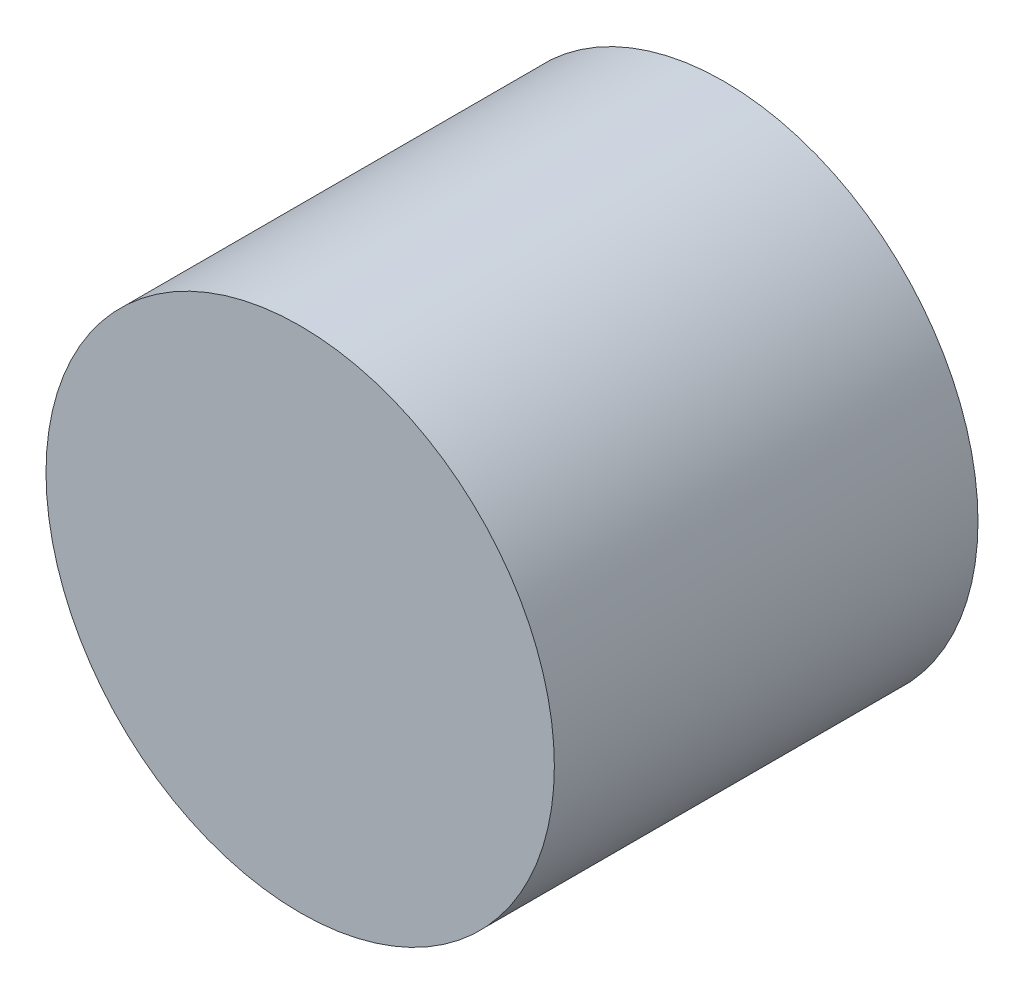
ISO-10303-21;
HEADER;
FILE_DESCRIPTION(('STEP AP214'),'2;1');
FILE_NAME('part.step','',(''),(''),'','','');
FILE_SCHEMA(('AUTOMOTIVE_DESIGN { 1 0 10303 214 1 1 1 1 }'));
ENDSEC;
DATA;
#1=APPLICATION_CONTEXT('core data for automotive mechanical design processes');
#2=APPLICATION_PROTOCOL_DEFINITION('international standard','automotive_design',2000,#1);
#3=PRODUCT_CONTEXT('',#1,'mechanical');
#4=PRODUCT('Part','Part','',(#3));
#5=PRODUCT_RELATED_PRODUCT_CATEGORY('part','',(#4));
#6=PRODUCT_DEFINITION_FORMATION('','',#4);
#7=PRODUCT_DEFINITION_CONTEXT('part definition',#1,'design');
#8=PRODUCT_DEFINITION('design','',#6,#7);
#9=PRODUCT_DEFINITION_SHAPE('','',#8);
#10=(LENGTH_UNIT() NAMED_UNIT(*) SI_UNIT(.MILLI.,.METRE.));
#11=(NAMED_UNIT(*) PLANE_ANGLE_UNIT() SI_UNIT($,.RADIAN.));
#12=(NAMED_UNIT(*) SI_UNIT($,.STERADIAN.) SOLID_ANGLE_UNIT());
#13=UNCERTAINTY_MEASURE_WITH_UNIT(LENGTH_MEASURE(1.E-05),#10,'distance_accuracy_value','');
#14=(GEOMETRIC_REPRESENTATION_CONTEXT(3) GLOBAL_UNCERTAINTY_ASSIGNED_CONTEXT((#13)) GLOBAL_UNIT_ASSIGNED_CONTEXT((#10,
#11,#12)) REPRESENTATION_CONTEXT('',''));
#15=CARTESIAN_POINT('',(0.,0.,0.));
#16=DIRECTION('',(0.,0.,1.));
#17=DIRECTION('',(1.,0.,0.));
#18=AXIS2_PLACEMENT_3D('',#15,#16,#17);
#19=CARTESIAN_POINT('',(0.,0.,5.));
#20=DIRECTION('',(0.,0.,-1.));
#21=DIRECTION('',(-1.,0.,0.));
#22=AXIS2_PLACEMENT_3D('',#19,#20,#21);
#23=CYLINDRICAL_SURFACE('',#22,1.5);
#24=CARTESIAN_POINT('',(0.,0.,0.));
#25=DIRECTION('',(0.,0.,1.));
#26=DIRECTION('',(1.,0.,0.));
#27=AXIS2_PLACEMENT_3D('',#24,#25,#26);
#28=CIRCLE('',#27,1.5);
#29=CARTESIAN_POINT('',(-1.11803398874989,1.,0.));
#30=VERTEX_POINT('',#29);
#31=CARTESIAN_POINT('',(1.11803398874989,1.,0.));
#32=VERTEX_POINT('',#31);
#33=EDGE_CURVE('E74',#30,#32,#28,.T.);
#34=ORIENTED_EDGE('',*,*,#33,.T.);
#35=DIRECTION('',(0.,0.,-1.));
#36=VECTOR('',#35,1.);
#37=CARTESIAN_POINT('',(1.11803398874989,1.,5.));
#38=LINE('',#37,#36);
#39=CARTESIAN_POINT('',(1.11803398874989,1.,5.));
#40=VERTEX_POINT('',#39);
#41=EDGE_CURVE('E11',#40,#32,#38,.T.);
#42=ORIENTED_EDGE('',*,*,#41,.F.);
#43=CARTESIAN_POINT('',(0.,0.,5.));
#44=DIRECTION('',(0.,0.,1.));
#45=DIRECTION('',(1.,0.,0.));
#46=AXIS2_PLACEMENT_3D('',#43,#44,#45);
#47=CIRCLE('',#46,1.5);
#48=CARTESIAN_POINT('',(-1.1180339887499,1.,5.));
#49=VERTEX_POINT('',#48);
#50=EDGE_CURVE('E67',#40,#49,#47,.T.);
#51=ORIENTED_EDGE('',*,*,#50,.T.);
#52=DIRECTION('',(0.,0.,-1.));
#53=VECTOR('',#52,1.);
#54=CARTESIAN_POINT('',(-1.11803398874989,1.,5.));
#55=LINE('',#54,#53);
#56=EDGE_CURVE('E43',#49,#30,#55,.T.);
#57=ORIENTED_EDGE('',*,*,#56,.T.);
#58=EDGE_LOOP('',(#34,#42,#51,#57));
#59=FACE_BOUND('',#58,.T.);
#60=CARTESIAN_POINT('',(0.,0.,7.));
#61=DIRECTION('',(0.,0.,1.));
#62=DIRECTION('',(1.,0.,0.));
#63=AXIS2_PLACEMENT_3D('',#60,#61,#62);
#64=CIRCLE('',#63,1.5);
#65=CARTESIAN_POINT('',(1.5,0.,7.));
#66=VERTEX_POINT('',#65);
#67=EDGE_CURVE('E70',#66,#66,#64,.T.);
#68=ORIENTED_EDGE('',*,*,#67,.F.);
#69=EDGE_LOOP('',(#68));
#70=FACE_BOUND('',#69,.T.);
#71=ADVANCED_FACE('F35',(#59,#70),#23,.T.);
#72=CARTESIAN_POINT('',(0.,1.,5.));
#73=DIRECTION('',(0.,-1.,0.));
#74=DIRECTION('',(0.,0.,-1.));
#75=AXIS2_PLACEMENT_3D('',#72,#73,#74);
#76=PLANE('',#75);
#77=DIRECTION('',(-1.,0.,0.));
#78=VECTOR('',#77,1.);
#79=CARTESIAN_POINT('',(0.,1.,0.));
#80=LINE('',#79,#78);
#81=EDGE_CURVE('E58',#32,#30,#80,.T.);
#82=ORIENTED_EDGE('',*,*,#81,.T.);
#83=ORIENTED_EDGE('',*,*,#56,.F.);
#84=DIRECTION('',(-1.,0.,0.));
#85=VECTOR('',#84,1.);
#86=CARTESIAN_POINT('',(0.,1.,5.));
#87=LINE('',#86,#85);
#88=EDGE_CURVE('E49',#40,#49,#87,.T.);
#89=ORIENTED_EDGE('',*,*,#88,.F.);
#90=ORIENTED_EDGE('',*,*,#41,.T.);
#91=EDGE_LOOP('',(#82,#83,#89,#90));
#92=FACE_BOUND('',#91,.T.);
#93=ADVANCED_FACE('F60',(#92),#76,.F.);
#94=CARTESIAN_POINT('',(0.,0.,0.));
#95=DIRECTION('',(0.,0.,1.));
#96=DIRECTION('',(1.,0.,0.));
#97=AXIS2_PLACEMENT_3D('',#94,#95,#96);
#98=PLANE('',#97);
#99=ORIENTED_EDGE('',*,*,#33,.F.);
#100=ORIENTED_EDGE('',*,*,#81,.F.);
#101=EDGE_LOOP('',(#99,#100));
#102=FACE_BOUND('',#101,.T.);
#103=ADVANCED_FACE('F82',(#102),#98,.F.);
#104=CARTESIAN_POINT('',(0.,0.,5.));
#105=DIRECTION('',(0.,0.,1.));
#106=DIRECTION('',(1.,0.,0.));
#107=AXIS2_PLACEMENT_3D('',#104,#105,#106);
#108=PLANE('',#107);
#109=ORIENTED_EDGE('',*,*,#50,.F.);
#110=ORIENTED_EDGE('',*,*,#88,.T.);
#111=EDGE_LOOP('',(#109,#110));
#112=FACE_BOUND('',#111,.T.);
#113=ADVANCED_FACE('F66',(#112),#108,.F.);
#114=CARTESIAN_POINT('',(0.,0.131238961188274,32.));
#115=DIRECTION('',(0.,0.,-1.));
#116=DIRECTION('',(-1.,0.,0.));
#117=AXIS2_PLACEMENT_3D('',#114,#115,#116);
#118=CYLINDRICAL_SURFACE('',#117,15.);
#119=CARTESIAN_POINT('',(0.,0.131238961188274,32.));
#120=DIRECTION('',(0.,0.,1.));
#121=DIRECTION('',(1.,0.,0.));
#122=AXIS2_PLACEMENT_3D('',#119,#120,#121);
#123=CIRCLE('',#122,15.);
#124=CARTESIAN_POINT('',(15.,0.131238961188274,32.));
#125=VERTEX_POINT('',#124);
#126=EDGE_CURVE('E71',#125,#125,#123,.T.);
#127=ORIENTED_EDGE('',*,*,#126,.F.);
#128=EDGE_LOOP('',(#127));
#129=FACE_BOUND('',#128,.T.);
#130=CARTESIAN_POINT('',(0.,0.131238961188274,7.));
#131=DIRECTION('',(0.,0.,1.));
#132=DIRECTION('',(1.,0.,0.));
#133=AXIS2_PLACEMENT_3D('',#130,#131,#132);
#134=CIRCLE('',#133,15.);
#135=CARTESIAN_POINT('',(15.,0.131238961188274,7.));
#136=VERTEX_POINT('',#135);
#137=EDGE_CURVE('E77',#136,#136,#134,.T.);
#138=ORIENTED_EDGE('',*,*,#137,.T.);
#139=EDGE_LOOP('',(#138));
#140=FACE_BOUND('',#139,.T.);
#141=ADVANCED_FACE('F89',(#129,#140),#118,.T.);
#142=CARTESIAN_POINT('',(0.,0.131238961188274,32.));
#143=DIRECTION('',(0.,0.,1.));
#144=DIRECTION('',(1.,0.,0.));
#145=AXIS2_PLACEMENT_3D('',#142,#143,#144);
#146=PLANE('',#145);
#147=ORIENTED_EDGE('',*,*,#126,.T.);
#148=EDGE_LOOP('',(#147));
#149=FACE_BOUND('',#148,.T.);
#150=ADVANCED_FACE('F115',(#149),#146,.T.);
#151=CARTESIAN_POINT('',(0.,0.131238961188274,7.));
#152=DIRECTION('',(0.,0.,1.));
#153=DIRECTION('',(1.,0.,0.));
#154=AXIS2_PLACEMENT_3D('',#151,#152,#153);
#155=PLANE('',#154);
#156=ORIENTED_EDGE('',*,*,#67,.T.);
#157=EDGE_LOOP('',(#156));
#158=FACE_BOUND('',#157,.T.);
#159=ORIENTED_EDGE('',*,*,#137,.F.);
#160=EDGE_LOOP('',(#159));
#161=FACE_BOUND('',#160,.T.);
#162=ADVANCED_FACE('F125',(#158,#161),#155,.F.);
#163=CLOSED_SHELL('',(#71,#93,#103,#113,#141,#150,#162));
#164=MANIFOLD_SOLID_BREP('B2',#163);
#165=ADVANCED_BREP_SHAPE_REPRESENTATION('',(#18,#164),#14);
#166=SHAPE_DEFINITION_REPRESENTATION(#9,#165);
ENDSEC;
END-ISO-10303-21;
